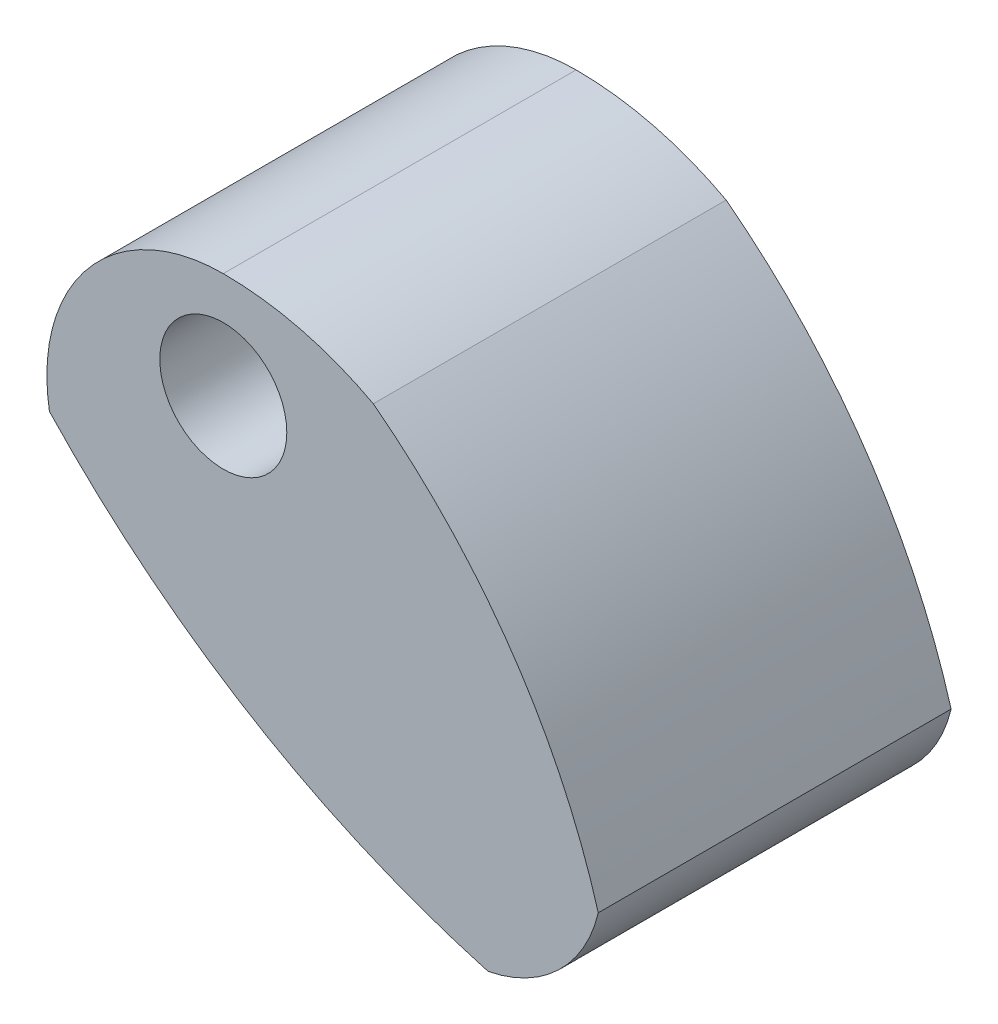
ISO-10303-21;
HEADER;
FILE_DESCRIPTION(('STEP AP214'),'2;1');
FILE_NAME('part.step','',(''),(''),'','','');
FILE_SCHEMA(('AUTOMOTIVE_DESIGN { 1 0 10303 214 1 1 1 1 }'));
ENDSEC;
DATA;
#1=APPLICATION_CONTEXT('core data for automotive mechanical design processes');
#2=APPLICATION_PROTOCOL_DEFINITION('international standard','automotive_design',2000,#1);
#3=PRODUCT_CONTEXT('',#1,'mechanical');
#4=PRODUCT('Part','Part','',(#3));
#5=PRODUCT_RELATED_PRODUCT_CATEGORY('part','',(#4));
#6=PRODUCT_DEFINITION_FORMATION('','',#4);
#7=PRODUCT_DEFINITION_CONTEXT('part definition',#1,'design');
#8=PRODUCT_DEFINITION('design','',#6,#7);
#9=PRODUCT_DEFINITION_SHAPE('','',#8);
#10=(LENGTH_UNIT() NAMED_UNIT(*) SI_UNIT(.MILLI.,.METRE.));
#11=(NAMED_UNIT(*) PLANE_ANGLE_UNIT() SI_UNIT($,.RADIAN.));
#12=(NAMED_UNIT(*) SI_UNIT($,.STERADIAN.) SOLID_ANGLE_UNIT());
#13=UNCERTAINTY_MEASURE_WITH_UNIT(LENGTH_MEASURE(1.E-05),#10,'distance_accuracy_value','');
#14=(GEOMETRIC_REPRESENTATION_CONTEXT(3) GLOBAL_UNCERTAINTY_ASSIGNED_CONTEXT((#13)) GLOBAL_UNIT_ASSIGNED_CONTEXT((#10,
#11,#12)) REPRESENTATION_CONTEXT('',''));
#15=CARTESIAN_POINT('',(0.,0.,0.));
#16=DIRECTION('',(0.,0.,1.));
#17=DIRECTION('',(1.,0.,0.));
#18=AXIS2_PLACEMENT_3D('',#15,#16,#17);
#19=CARTESIAN_POINT('',(14.7558361628614,17.6339188873717,10.));
#20=DIRECTION('',(0.,0.,-1.));
#21=DIRECTION('',(-1.,0.,0.));
#22=AXIS2_PLACEMENT_3D('',#19,#20,#21);
#23=CYLINDRICAL_SURFACE('',#22,27.);
#24=CARTESIAN_POINT('',(14.7558361628614,17.6339188873717,0.));
#25=DIRECTION('',(0.,0.,1.));
#26=DIRECTION('',(1.,0.,0.));
#27=AXIS2_PLACEMENT_3D('',#24,#25,#26);
#28=CIRCLE('',#27,27.);
#29=CARTESIAN_POINT('',(-4.92766522488857,-0.847416917121553,0.));
#30=VERTEX_POINT('',#29);
#31=CARTESIAN_POINT('',(7.5045969424804,-8.37414774144188,0.));
#32=VERTEX_POINT('',#31);
#33=EDGE_CURVE('E124',#30,#32,#28,.T.);
#34=ORIENTED_EDGE('',*,*,#33,.T.);
#35=DIRECTION('',(0.,0.,-1.));
#36=VECTOR('',#35,1.);
#37=CARTESIAN_POINT('',(7.5045969424804,-8.37414774144188,10.));
#38=LINE('',#37,#36);
#39=CARTESIAN_POINT('',(7.5045969424804,-8.37414774144188,10.));
#40=VERTEX_POINT('',#39);
#41=EDGE_CURVE('E11',#40,#32,#38,.T.);
#42=ORIENTED_EDGE('',*,*,#41,.F.);
#43=CARTESIAN_POINT('',(14.7558361628614,17.6339188873717,10.));
#44=DIRECTION('',(0.,0.,1.));
#45=DIRECTION('',(1.,0.,0.));
#46=AXIS2_PLACEMENT_3D('',#43,#44,#45);
#47=CIRCLE('',#46,27.);
#48=CARTESIAN_POINT('',(-4.92766522488857,-0.847416917121553,10.));
#49=VERTEX_POINT('',#48);
#50=EDGE_CURVE('E133',#49,#40,#47,.T.);
#51=ORIENTED_EDGE('',*,*,#50,.F.);
#52=DIRECTION('',(0.,0.,-1.));
#53=VECTOR('',#52,1.);
#54=CARTESIAN_POINT('',(-4.92766522488857,-0.847416917121553,10.));
#55=LINE('',#54,#53);
#56=EDGE_CURVE('E120',#49,#30,#55,.T.);
#57=ORIENTED_EDGE('',*,*,#56,.T.);
#58=EDGE_LOOP('',(#34,#42,#51,#57));
#59=FACE_BOUND('',#58,.T.);
#60=ADVANCED_FACE('F48',(#59),#23,.T.);
#61=CARTESIAN_POINT('',(6.73617889394571,-4.44864984911203,10.));
#62=DIRECTION('',(0.,0.,-1.));
#63=DIRECTION('',(-1.,0.,0.));
#64=AXIS2_PLACEMENT_3D('',#61,#62,#63);
#65=CYLINDRICAL_SURFACE('',#64,4.);
#66=CARTESIAN_POINT('',(6.73617889394571,-4.44864984911203,0.));
#67=DIRECTION('',(0.,0.,1.));
#68=DIRECTION('',(1.,0.,0.));
#69=AXIS2_PLACEMENT_3D('',#66,#67,#68);
#70=CIRCLE('',#69,4.);
#71=CARTESIAN_POINT('',(10.6276379585246,-5.37414774144189,0.));
#72=VERTEX_POINT('',#71);
#73=EDGE_CURVE('E127',#32,#72,#70,.T.);
#74=ORIENTED_EDGE('',*,*,#73,.T.);
#75=DIRECTION('',(0.,0.,-1.));
#76=VECTOR('',#75,1.);
#77=CARTESIAN_POINT('',(10.6276379585246,-5.37414774144189,10.));
#78=LINE('',#77,#76);
#79=CARTESIAN_POINT('',(10.6276379585246,-5.37414774144189,10.));
#80=VERTEX_POINT('',#79);
#81=EDGE_CURVE('E56',#80,#72,#78,.T.);
#82=ORIENTED_EDGE('',*,*,#81,.F.);
#83=CARTESIAN_POINT('',(6.73617889394571,-4.44864984911203,10.));
#84=DIRECTION('',(0.,0.,1.));
#85=DIRECTION('',(1.,0.,0.));
#86=AXIS2_PLACEMENT_3D('',#83,#84,#85);
#87=CIRCLE('',#86,4.);
#88=EDGE_CURVE('E99',#40,#80,#87,.T.);
#89=ORIENTED_EDGE('',*,*,#88,.F.);
#90=ORIENTED_EDGE('',*,*,#41,.T.);
#91=EDGE_LOOP('',(#74,#82,#89,#90));
#92=FACE_BOUND('',#91,.T.);
#93=ADVANCED_FACE('F154',(#92),#65,.T.);
#94=CARTESIAN_POINT('',(-6.66176505919359,-10.3817962206103,10.));
#95=DIRECTION('',(0.,0.,-1.));
#96=DIRECTION('',(-1.,0.,0.));
#97=AXIS2_PLACEMENT_3D('',#94,#95,#96);
#98=CYLINDRICAL_SURFACE('',#97,18.);
#99=CARTESIAN_POINT('',(-6.66176505919359,-10.3817962206103,0.));
#100=DIRECTION('',(0.,0.,1.));
#101=DIRECTION('',(1.,0.,0.));
#102=AXIS2_PLACEMENT_3D('',#99,#100,#101);
#103=CIRCLE('',#102,18.);
#104=CARTESIAN_POINT('',(4.2516887972733,3.93241088012594,0.));
#105=VERTEX_POINT('',#104);
#106=EDGE_CURVE('E115',#72,#105,#103,.T.);
#107=ORIENTED_EDGE('',*,*,#106,.T.);
#108=DIRECTION('',(0.,0.,-1.));
#109=VECTOR('',#108,1.);
#110=CARTESIAN_POINT('',(4.2516887972733,3.93241088012594,10.));
#111=LINE('',#110,#109);
#112=CARTESIAN_POINT('',(4.2516887972733,3.93241088012594,10.));
#113=VERTEX_POINT('',#112);
#114=EDGE_CURVE('E112',#113,#105,#111,.T.);
#115=ORIENTED_EDGE('',*,*,#114,.F.);
#116=CARTESIAN_POINT('',(-6.66176505919359,-10.3817962206103,10.));
#117=DIRECTION('',(0.,0.,1.));
#118=DIRECTION('',(1.,0.,0.));
#119=AXIS2_PLACEMENT_3D('',#116,#117,#118);
#120=CIRCLE('',#119,18.);
#121=EDGE_CURVE('E104',#80,#113,#120,.T.);
#122=ORIENTED_EDGE('',*,*,#121,.F.);
#123=ORIENTED_EDGE('',*,*,#81,.T.);
#124=EDGE_LOOP('',(#107,#115,#122,#123));
#125=FACE_BOUND('',#124,.T.);
#126=ADVANCED_FACE('F113',(#125),#98,.T.);
#127=CARTESIAN_POINT('',(0.,-4.,10.));
#128=DIRECTION('',(0.,0.,-1.));
#129=DIRECTION('',(-1.,0.,0.));
#130=AXIS2_PLACEMENT_3D('',#127,#128,#129);
#131=CYLINDRICAL_SURFACE('',#130,8.99999999999999);
#132=CARTESIAN_POINT('',(0.,-4.,0.));
#133=DIRECTION('',(0.,0.,1.));
#134=DIRECTION('',(1.,0.,0.));
#135=AXIS2_PLACEMENT_3D('',#132,#133,#134);
#136=CIRCLE('',#135,8.99999999999999);
#137=CARTESIAN_POINT('',(0.,4.99999999999999,0.));
#138=VERTEX_POINT('',#137);
#139=EDGE_CURVE('E85',#105,#138,#136,.T.);
#140=ORIENTED_EDGE('',*,*,#139,.T.);
#141=DIRECTION('',(0.,0.,-1.));
#142=VECTOR('',#141,1.);
#143=CARTESIAN_POINT('',(0.,4.99999999999999,10.));
#144=LINE('',#143,#142);
#145=CARTESIAN_POINT('',(0.,4.99999999999999,10.));
#146=VERTEX_POINT('',#145);
#147=EDGE_CURVE('E116',#146,#138,#144,.T.);
#148=ORIENTED_EDGE('',*,*,#147,.F.);
#149=CARTESIAN_POINT('',(0.,-4.,10.));
#150=DIRECTION('',(0.,0.,1.));
#151=DIRECTION('',(1.,0.,0.));
#152=AXIS2_PLACEMENT_3D('',#149,#150,#151);
#153=CIRCLE('',#152,8.99999999999999);
#154=EDGE_CURVE('E108',#113,#146,#153,.T.);
#155=ORIENTED_EDGE('',*,*,#154,.F.);
#156=ORIENTED_EDGE('',*,*,#114,.T.);
#157=EDGE_LOOP('',(#140,#148,#155,#156));
#158=FACE_BOUND('',#157,.T.);
#159=ADVANCED_FACE('F118',(#158),#131,.T.);
#160=CARTESIAN_POINT('',(0.,0.,10.));
#161=DIRECTION('',(0.,0.,-1.));
#162=DIRECTION('',(-1.,0.,0.));
#163=AXIS2_PLACEMENT_3D('',#160,#161,#162);
#164=CYLINDRICAL_SURFACE('',#163,5.);
#165=CARTESIAN_POINT('',(0.,0.,0.));
#166=DIRECTION('',(0.,0.,1.));
#167=DIRECTION('',(1.,0.,0.));
#168=AXIS2_PLACEMENT_3D('',#165,#166,#167);
#169=CIRCLE('',#168,5.);
#170=EDGE_CURVE('E91',#138,#30,#169,.T.);
#171=ORIENTED_EDGE('',*,*,#170,.T.);
#172=ORIENTED_EDGE('',*,*,#56,.F.);
#173=CARTESIAN_POINT('',(0.,0.,10.));
#174=DIRECTION('',(0.,0.,1.));
#175=DIRECTION('',(1.,0.,0.));
#176=AXIS2_PLACEMENT_3D('',#173,#174,#175);
#177=CIRCLE('',#176,5.);
#178=EDGE_CURVE('E64',#146,#49,#177,.T.);
#179=ORIENTED_EDGE('',*,*,#178,.F.);
#180=ORIENTED_EDGE('',*,*,#147,.T.);
#181=EDGE_LOOP('',(#171,#172,#179,#180));
#182=FACE_BOUND('',#181,.T.);
#183=ADVANCED_FACE('F141',(#182),#164,.T.);
#184=CARTESIAN_POINT('',(0.,0.,10.));
#185=DIRECTION('',(0.,0.,1.));
#186=DIRECTION('',(1.,0.,0.));
#187=AXIS2_PLACEMENT_3D('',#184,#185,#186);
#188=PLANE('',#187);
#189=CARTESIAN_POINT('',(0.,2.,10.));
#190=DIRECTION('',(0.,0.,1.));
#191=DIRECTION('',(1.,0.,0.));
#192=AXIS2_PLACEMENT_3D('',#189,#190,#191);
#193=CIRCLE('',#192,1.8);
#194=CARTESIAN_POINT('',(1.8,2.,10.));
#195=VERTEX_POINT('',#194);
#196=EDGE_CURVE('E237',#195,#195,#193,.T.);
#197=ORIENTED_EDGE('',*,*,#196,.F.);
#198=EDGE_LOOP('',(#197));
#199=FACE_BOUND('',#198,.T.);
#200=ORIENTED_EDGE('',*,*,#50,.T.);
#201=ORIENTED_EDGE('',*,*,#88,.T.);
#202=ORIENTED_EDGE('',*,*,#121,.T.);
#203=ORIENTED_EDGE('',*,*,#154,.T.);
#204=ORIENTED_EDGE('',*,*,#178,.T.);
#205=EDGE_LOOP('',(#200,#201,#202,#203,#204));
#206=FACE_BOUND('',#205,.T.);
#207=ADVANCED_FACE('F106',(#199,#206),#188,.T.);
#208=CARTESIAN_POINT('',(0.,0.,0.));
#209=DIRECTION('',(0.,0.,1.));
#210=DIRECTION('',(1.,0.,0.));
#211=AXIS2_PLACEMENT_3D('',#208,#209,#210);
#212=PLANE('',#211);
#213=ORIENTED_EDGE('',*,*,#33,.F.);
#214=ORIENTED_EDGE('',*,*,#170,.F.);
#215=ORIENTED_EDGE('',*,*,#139,.F.);
#216=ORIENTED_EDGE('',*,*,#106,.F.);
#217=ORIENTED_EDGE('',*,*,#73,.F.);
#218=EDGE_LOOP('',(#213,#214,#215,#216,#217));
#219=FACE_BOUND('',#218,.T.);
#220=ADVANCED_FACE('F137',(#219),#212,.F.);
#221=CARTESIAN_POINT('',(0.,2.,5.));
#222=DIRECTION('',(0.,0.,1.));
#223=DIRECTION('',(1.,0.,0.));
#224=AXIS2_PLACEMENT_3D('',#221,#222,#223);
#225=CONICAL_SURFACE('',#224,1.8,1.02974425867665);
#226=CARTESIAN_POINT('',(0.,2.,3.91845088575039));
#227=VERTEX_POINT('',#226);
#228=VERTEX_LOOP('',#227);
#229=FACE_BOUND('',#228,.T.);
#230=CARTESIAN_POINT('',(0.,2.,5.));
#231=DIRECTION('',(0.,0.,1.));
#232=DIRECTION('',(1.,0.,0.));
#233=AXIS2_PLACEMENT_3D('',#230,#231,#232);
#234=CIRCLE('',#233,1.8);
#235=CARTESIAN_POINT('',(1.8,2.,5.));
#236=VERTEX_POINT('',#235);
#237=EDGE_CURVE('E128',#236,#236,#234,.T.);
#238=ORIENTED_EDGE('',*,*,#237,.T.);
#239=EDGE_LOOP('',(#238));
#240=FACE_BOUND('',#239,.T.);
#241=ADVANCED_FACE('F189',(#229,#240),#225,.F.);
#242=CARTESIAN_POINT('',(0.,2.,10.));
#243=DIRECTION('',(0.,0.,1.));
#244=DIRECTION('',(1.,0.,0.));
#245=AXIS2_PLACEMENT_3D('',#242,#243,#244);
#246=CYLINDRICAL_SURFACE('',#245,1.8);
#247=ORIENTED_EDGE('',*,*,#237,.F.);
#248=EDGE_LOOP('',(#247));
#249=FACE_BOUND('',#248,.T.);
#250=ORIENTED_EDGE('',*,*,#196,.T.);
#251=EDGE_LOOP('',(#250));
#252=FACE_BOUND('',#251,.T.);
#253=ADVANCED_FACE('F196',(#249,#252),#246,.F.);
#254=CLOSED_SHELL('',(#60,#93,#126,#159,#183,#207,#220,#241,#253));
#255=MANIFOLD_SOLID_BREP('B2',#254);
#256=ADVANCED_BREP_SHAPE_REPRESENTATION('',(#18,#255),#14);
#257=SHAPE_DEFINITION_REPRESENTATION(#9,#256);
ENDSEC;
END-ISO-10303-21;
